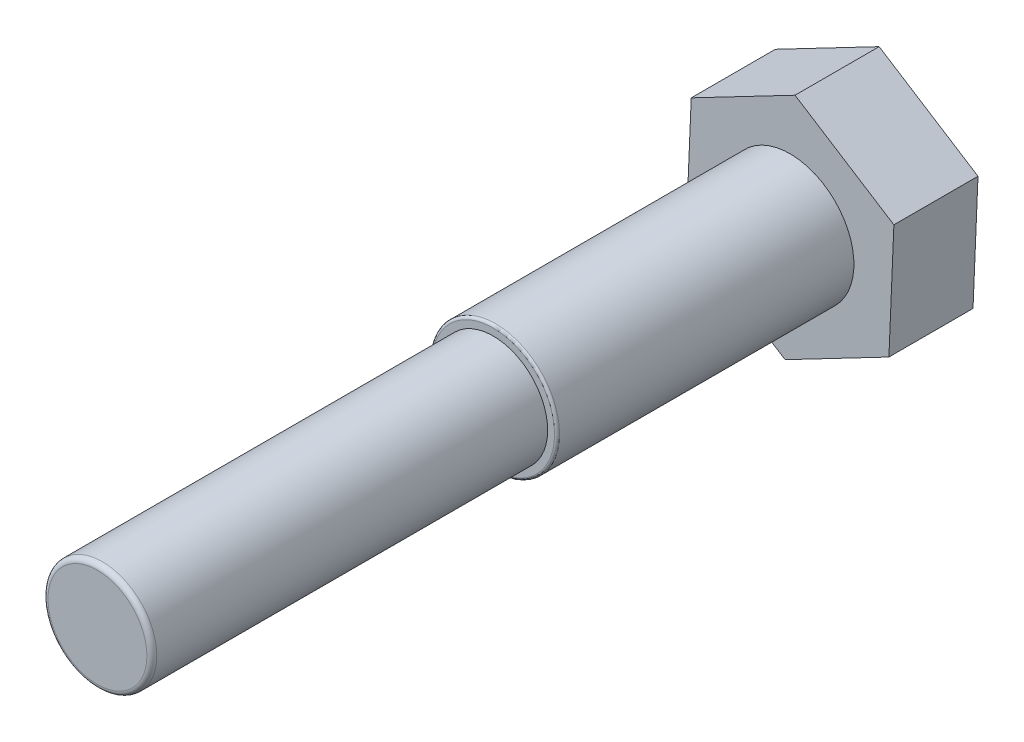
ISO-10303-21;
HEADER;
FILE_DESCRIPTION(('STEP AP214'),'2;1');
FILE_NAME('part.step','',(''),(''),'','','');
FILE_SCHEMA(('AUTOMOTIVE_DESIGN { 1 0 10303 214 1 1 1 1 }'));
ENDSEC;
DATA;
#1=APPLICATION_CONTEXT('core data for automotive mechanical design processes');
#2=APPLICATION_PROTOCOL_DEFINITION('international standard','automotive_design',2000,#1);
#3=PRODUCT_CONTEXT('',#1,'mechanical');
#4=PRODUCT('Part','Part','',(#3));
#5=PRODUCT_RELATED_PRODUCT_CATEGORY('part','',(#4));
#6=PRODUCT_DEFINITION_FORMATION('','',#4);
#7=PRODUCT_DEFINITION_CONTEXT('part definition',#1,'design');
#8=PRODUCT_DEFINITION('design','',#6,#7);
#9=PRODUCT_DEFINITION_SHAPE('','',#8);
#10=(LENGTH_UNIT() NAMED_UNIT(*) SI_UNIT(.MILLI.,.METRE.));
#11=(NAMED_UNIT(*) PLANE_ANGLE_UNIT() SI_UNIT($,.RADIAN.));
#12=(NAMED_UNIT(*) SI_UNIT($,.STERADIAN.) SOLID_ANGLE_UNIT());
#13=UNCERTAINTY_MEASURE_WITH_UNIT(LENGTH_MEASURE(1.E-05),#10,'distance_accuracy_value','');
#14=(GEOMETRIC_REPRESENTATION_CONTEXT(3) GLOBAL_UNCERTAINTY_ASSIGNED_CONTEXT((#13)) GLOBAL_UNIT_ASSIGNED_CONTEXT((#10,
#11,#12)) REPRESENTATION_CONTEXT('',''));
#15=CARTESIAN_POINT('',(0.,0.,0.));
#16=DIRECTION('',(0.,0.,1.));
#17=DIRECTION('',(1.,0.,0.));
#18=AXIS2_PLACEMENT_3D('',#15,#16,#17);
#19=CARTESIAN_POINT('',(0.,0.,77.));
#20=DIRECTION('',(0.,0.,1.));
#21=DIRECTION('',(1.,0.,0.));
#22=AXIS2_PLACEMENT_3D('',#19,#20,#21);
#23=PLANE('',#22);
#24=CARTESIAN_POINT('',(0.,0.,77.));
#25=DIRECTION('',(0.,0.,1.));
#26=DIRECTION('',(1.,0.,0.));
#27=AXIS2_PLACEMENT_3D('',#24,#25,#26);
#28=CIRCLE('',#27,12.4);
#29=CARTESIAN_POINT('',(12.4,0.,77.));
#30=VERTEX_POINT('',#29);
#31=EDGE_CURVE('E45',#30,#30,#28,.T.);
#32=ORIENTED_EDGE('',*,*,#31,.T.);
#33=EDGE_LOOP('',(#32));
#34=FACE_BOUND('',#33,.T.);
#35=CARTESIAN_POINT('',(0.,0.,77.));
#36=DIRECTION('',(0.,0.,1.));
#37=DIRECTION('',(1.,0.,0.));
#38=AXIS2_PLACEMENT_3D('',#35,#36,#37);
#39=CIRCLE('',#38,11.);
#40=CARTESIAN_POINT('',(11.,0.,77.));
#41=VERTEX_POINT('',#40);
#42=EDGE_CURVE('E127',#41,#41,#39,.T.);
#43=ORIENTED_EDGE('',*,*,#42,.F.);
#44=EDGE_LOOP('',(#43));
#45=FACE_BOUND('',#44,.T.);
#46=ADVANCED_FACE('F36',(#34,#45),#23,.T.);
#47=CARTESIAN_POINT('',(18.9733976863162,-36.3457037383633,17.));
#48=DIRECTION('',(0.,0.,-1.));
#49=DIRECTION('',(-1.,0.,0.));
#50=AXIS2_PLACEMENT_3D('',#47,#48,#49);
#51=PLANE('',#50);
#52=DIRECTION('',(0.0424733530909036,0.999097599975706,0.));
#53=VECTOR('',#52,1.);
#54=CARTESIAN_POINT('',(19.9787997617734,-12.6957037383635,17.));
#55=LINE('',#54,#53);
#56=CARTESIAN_POINT('',(19.9787997617734,-12.6957037383635,17.));
#57=VERTEX_POINT('',#56);
#58=CARTESIAN_POINT('',(20.9842018372306,10.9542962616365,17.));
#59=VERTEX_POINT('',#58);
#60=EDGE_CURVE('E134',#57,#59,#55,.T.);
#61=ORIENTED_EDGE('',*,*,#60,.T.);
#62=DIRECTION('',(-0.844007225893572,0.536331802748482,0.));
#63=VECTOR('',#62,1.);
#64=CARTESIAN_POINT('',(20.9842018372306,10.9542962616365,17.));
#65=LINE('',#64,#63);
#66=CARTESIAN_POINT('',(1.0054020754572,23.65,17.));
#67=VERTEX_POINT('',#66);
#68=EDGE_CURVE('E91',#59,#67,#65,.T.);
#69=ORIENTED_EDGE('',*,*,#68,.T.);
#70=DIRECTION('',(-0.886480578984472,-0.462765797227231,0.));
#71=VECTOR('',#70,1.);
#72=CARTESIAN_POINT('',(1.0054020754572,23.65,17.));
#73=LINE('',#72,#71);
#74=CARTESIAN_POINT('',(-19.9787997617736,12.6957037383632,17.));
#75=VERTEX_POINT('',#74);
#76=EDGE_CURVE('E105',#67,#75,#73,.T.);
#77=ORIENTED_EDGE('',*,*,#76,.T.);
#78=DIRECTION('',(-0.0424733530908878,-0.999097599975706,0.));
#79=VECTOR('',#78,1.);
#80=CARTESIAN_POINT('',(-19.9787997617736,12.6957037383632,17.));
#81=LINE('',#80,#79);
#82=CARTESIAN_POINT('',(-20.9842018372304,-10.9542962616368,17.));
#83=VERTEX_POINT('',#82);
#84=EDGE_CURVE('E98',#75,#83,#81,.T.);
#85=ORIENTED_EDGE('',*,*,#84,.T.);
#86=DIRECTION('',(0.844007225893576,-0.536331802748476,0.));
#87=VECTOR('',#86,1.);
#88=CARTESIAN_POINT('',(-20.9842018372304,-10.9542962616368,17.));
#89=LINE('',#88,#87);
#90=CARTESIAN_POINT('',(-1.00540207545719,-23.65,17.));
#91=VERTEX_POINT('',#90);
#92=EDGE_CURVE('E103',#83,#91,#89,.T.);
#93=ORIENTED_EDGE('',*,*,#92,.T.);
#94=DIRECTION('',(0.886480578984476,0.462765797227224,0.));
#95=VECTOR('',#94,1.);
#96=CARTESIAN_POINT('',(-1.00540207545719,-23.65,17.));
#97=LINE('',#96,#95);
#98=EDGE_CURVE('E53',#91,#57,#97,.T.);
#99=ORIENTED_EDGE('',*,*,#98,.T.);
#100=EDGE_LOOP('',(#61,#69,#77,#85,#93,#99));
#101=FACE_BOUND('',#100,.T.);
#102=CARTESIAN_POINT('',(0.,0.,17.));
#103=DIRECTION('',(0.,0.,-1.));
#104=DIRECTION('',(-1.,0.,0.));
#105=AXIS2_PLACEMENT_3D('',#102,#103,#104);
#106=CIRCLE('',#105,12.9);
#107=CARTESIAN_POINT('',(-12.9,0.,17.));
#108=VERTEX_POINT('',#107);
#109=EDGE_CURVE('E143',#108,#108,#106,.F.);
#110=ORIENTED_EDGE('',*,*,#109,.F.);
#111=EDGE_LOOP('',(#110));
#112=FACE_BOUND('',#111,.T.);
#113=ADVANCED_FACE('F100',(#101,#112),#51,.F.);
#114=CARTESIAN_POINT('',(19.9787997617734,-12.6957037383635,17.));
#115=DIRECTION('',(-0.999097599975706,0.0424733530909036,0.));
#116=DIRECTION('',(-0.0424733530909036,-0.999097599975706,0.));
#117=AXIS2_PLACEMENT_3D('',#114,#115,#116);
#118=PLANE('',#117);
#119=DIRECTION('',(0.0424733530909036,0.999097599975706,0.));
#120=VECTOR('',#119,1.);
#121=CARTESIAN_POINT('',(19.9787997617734,-12.6957037383635,0.));
#122=LINE('',#121,#120);
#123=CARTESIAN_POINT('',(19.9787997617734,-12.6957037383635,0.));
#124=VERTEX_POINT('',#123);
#125=CARTESIAN_POINT('',(20.9842018372306,10.9542962616365,0.));
#126=VERTEX_POINT('',#125);
#127=EDGE_CURVE('E123',#124,#126,#122,.T.);
#128=ORIENTED_EDGE('',*,*,#127,.T.);
#129=DIRECTION('',(0.,0.,-1.));
#130=VECTOR('',#129,1.);
#131=CARTESIAN_POINT('',(20.9842018372306,10.9542962616365,17.));
#132=LINE('',#131,#130);
#133=EDGE_CURVE('E141',#59,#126,#132,.T.);
#134=ORIENTED_EDGE('',*,*,#133,.F.);
#135=ORIENTED_EDGE('',*,*,#60,.F.);
#136=DIRECTION('',(0.,0.,-1.));
#137=VECTOR('',#136,1.);
#138=CARTESIAN_POINT('',(19.9787997617734,-12.6957037383635,17.));
#139=LINE('',#138,#137);
#140=EDGE_CURVE('E119',#57,#124,#139,.T.);
#141=ORIENTED_EDGE('',*,*,#140,.T.);
#142=EDGE_LOOP('',(#128,#134,#135,#141));
#143=FACE_BOUND('',#142,.T.);
#144=ADVANCED_FACE('F170',(#143),#118,.F.);
#145=CARTESIAN_POINT('',(20.9842018372306,10.9542962616365,17.));
#146=DIRECTION('',(-0.536331802748482,-0.844007225893572,0.));
#147=DIRECTION('',(0.844007225893572,-0.536331802748482,0.));
#148=AXIS2_PLACEMENT_3D('',#145,#146,#147);
#149=PLANE('',#148);
#150=DIRECTION('',(-0.844007225893572,0.536331802748482,0.));
#151=VECTOR('',#150,1.);
#152=CARTESIAN_POINT('',(20.9842018372306,10.9542962616365,0.));
#153=LINE('',#152,#151);
#154=CARTESIAN_POINT('',(1.0054020754572,23.65,0.));
#155=VERTEX_POINT('',#154);
#156=EDGE_CURVE('E126',#126,#155,#153,.T.);
#157=ORIENTED_EDGE('',*,*,#156,.T.);
#158=DIRECTION('',(0.,0.,-1.));
#159=VECTOR('',#158,1.);
#160=CARTESIAN_POINT('',(1.0054020754572,23.65,17.));
#161=LINE('',#160,#159);
#162=EDGE_CURVE('E138',#67,#155,#161,.T.);
#163=ORIENTED_EDGE('',*,*,#162,.F.);
#164=ORIENTED_EDGE('',*,*,#68,.F.);
#165=ORIENTED_EDGE('',*,*,#133,.T.);
#166=EDGE_LOOP('',(#157,#163,#164,#165));
#167=FACE_BOUND('',#166,.T.);
#168=ADVANCED_FACE('F194',(#167),#149,.F.);
#169=CARTESIAN_POINT('',(1.0054020754572,23.65,17.));
#170=DIRECTION('',(0.462765797227231,-0.886480578984472,0.));
#171=DIRECTION('',(0.886480578984472,0.462765797227231,0.));
#172=AXIS2_PLACEMENT_3D('',#169,#170,#171);
#173=PLANE('',#172);
#174=DIRECTION('',(-0.886480578984472,-0.462765797227231,0.));
#175=VECTOR('',#174,1.);
#176=CARTESIAN_POINT('',(1.0054020754572,23.65,0.));
#177=LINE('',#176,#175);
#178=CARTESIAN_POINT('',(-19.9787997617736,12.6957037383632,0.));
#179=VERTEX_POINT('',#178);
#180=EDGE_CURVE('E129',#155,#179,#177,.T.);
#181=ORIENTED_EDGE('',*,*,#180,.T.);
#182=DIRECTION('',(0.,0.,-1.));
#183=VECTOR('',#182,1.);
#184=CARTESIAN_POINT('',(-19.9787997617736,12.6957037383632,17.));
#185=LINE('',#184,#183);
#186=EDGE_CURVE('E114',#75,#179,#185,.T.);
#187=ORIENTED_EDGE('',*,*,#186,.F.);
#188=ORIENTED_EDGE('',*,*,#76,.F.);
#189=ORIENTED_EDGE('',*,*,#162,.T.);
#190=EDGE_LOOP('',(#181,#187,#188,#189));
#191=FACE_BOUND('',#190,.T.);
#192=ADVANCED_FACE('F191',(#191),#173,.F.);
#193=CARTESIAN_POINT('',(-19.9787997617736,12.6957037383632,17.));
#194=DIRECTION('',(0.999097599975706,-0.0424733530908878,0.));
#195=DIRECTION('',(0.0424733530908878,0.999097599975707,0.));
#196=AXIS2_PLACEMENT_3D('',#193,#194,#195);
#197=PLANE('',#196);
#198=DIRECTION('',(-0.0424733530908878,-0.999097599975706,0.));
#199=VECTOR('',#198,1.);
#200=CARTESIAN_POINT('',(-19.9787997617736,12.6957037383632,0.));
#201=LINE('',#200,#199);
#202=CARTESIAN_POINT('',(-20.9842018372304,-10.9542962616368,0.));
#203=VERTEX_POINT('',#202);
#204=EDGE_CURVE('E113',#179,#203,#201,.T.);
#205=ORIENTED_EDGE('',*,*,#204,.T.);
#206=DIRECTION('',(0.,0.,-1.));
#207=VECTOR('',#206,1.);
#208=CARTESIAN_POINT('',(-20.9842018372304,-10.9542962616368,17.));
#209=LINE('',#208,#207);
#210=EDGE_CURVE('E110',#83,#203,#209,.T.);
#211=ORIENTED_EDGE('',*,*,#210,.F.);
#212=ORIENTED_EDGE('',*,*,#84,.F.);
#213=ORIENTED_EDGE('',*,*,#186,.T.);
#214=EDGE_LOOP('',(#205,#211,#212,#213));
#215=FACE_BOUND('',#214,.T.);
#216=ADVANCED_FACE('F111',(#215),#197,.F.);
#217=CARTESIAN_POINT('',(-20.9842018372304,-10.9542962616368,17.));
#218=DIRECTION('',(0.536331802748476,0.844007225893576,0.));
#219=DIRECTION('',(-0.844007225893576,0.536331802748476,0.));
#220=AXIS2_PLACEMENT_3D('',#217,#218,#219);
#221=PLANE('',#220);
#222=DIRECTION('',(0.844007225893576,-0.536331802748476,0.));
#223=VECTOR('',#222,1.);
#224=CARTESIAN_POINT('',(-20.9842018372304,-10.9542962616368,0.));
#225=LINE('',#224,#223);
#226=CARTESIAN_POINT('',(-1.00540207545719,-23.65,0.));
#227=VERTEX_POINT('',#226);
#228=EDGE_CURVE('E76',#203,#227,#225,.T.);
#229=ORIENTED_EDGE('',*,*,#228,.T.);
#230=DIRECTION('',(0.,0.,-1.));
#231=VECTOR('',#230,1.);
#232=CARTESIAN_POINT('',(-1.00540207545719,-23.65,17.));
#233=LINE('',#232,#231);
#234=EDGE_CURVE('E115',#91,#227,#233,.T.);
#235=ORIENTED_EDGE('',*,*,#234,.F.);
#236=ORIENTED_EDGE('',*,*,#92,.F.);
#237=ORIENTED_EDGE('',*,*,#210,.T.);
#238=EDGE_LOOP('',(#229,#235,#236,#237));
#239=FACE_BOUND('',#238,.T.);
#240=ADVANCED_FACE('F117',(#239),#221,.F.);
#241=CARTESIAN_POINT('',(-1.00540207545719,-23.65,17.));
#242=DIRECTION('',(-0.462765797227224,0.886480578984476,0.));
#243=DIRECTION('',(-0.886480578984476,-0.462765797227224,0.));
#244=AXIS2_PLACEMENT_3D('',#241,#242,#243);
#245=PLANE('',#244);
#246=DIRECTION('',(0.886480578984476,0.462765797227224,0.));
#247=VECTOR('',#246,1.);
#248=CARTESIAN_POINT('',(-1.00540207545719,-23.65,0.));
#249=LINE('',#248,#247);
#250=EDGE_CURVE('E82',#227,#124,#249,.T.);
#251=ORIENTED_EDGE('',*,*,#250,.T.);
#252=ORIENTED_EDGE('',*,*,#140,.F.);
#253=ORIENTED_EDGE('',*,*,#98,.F.);
#254=ORIENTED_EDGE('',*,*,#234,.T.);
#255=EDGE_LOOP('',(#251,#252,#253,#254));
#256=FACE_BOUND('',#255,.T.);
#257=ADVANCED_FACE('F183',(#256),#245,.F.);
#258=CARTESIAN_POINT('',(18.9733976863162,-36.3457037383633,0.));
#259=DIRECTION('',(0.,0.,-1.));
#260=DIRECTION('',(-1.,0.,0.));
#261=AXIS2_PLACEMENT_3D('',#258,#259,#260);
#262=PLANE('',#261);
#263=ORIENTED_EDGE('',*,*,#127,.F.);
#264=ORIENTED_EDGE('',*,*,#250,.F.);
#265=ORIENTED_EDGE('',*,*,#228,.F.);
#266=ORIENTED_EDGE('',*,*,#204,.F.);
#267=ORIENTED_EDGE('',*,*,#180,.F.);
#268=ORIENTED_EDGE('',*,*,#156,.F.);
#269=EDGE_LOOP('',(#263,#264,#265,#266,#267,#268));
#270=FACE_BOUND('',#269,.T.);
#271=ADVANCED_FACE('F178',(#270),#262,.T.);
#272=CARTESIAN_POINT('',(0.,0.,77.));
#273=DIRECTION('',(0.,0.,-1.));
#274=DIRECTION('',(-1.,0.,0.));
#275=AXIS2_PLACEMENT_3D('',#272,#273,#274);
#276=CYLINDRICAL_SURFACE('',#275,12.9);
#277=CARTESIAN_POINT('',(0.,0.,76.5));
#278=DIRECTION('',(0.,0.,1.));
#279=DIRECTION('',(1.,0.,0.));
#280=AXIS2_PLACEMENT_3D('',#277,#278,#279);
#281=CIRCLE('',#280,12.9);
#282=CARTESIAN_POINT('',(12.9,0.,76.5));
#283=VERTEX_POINT('',#282);
#284=EDGE_CURVE('E11',#283,#283,#281,.F.);
#285=ORIENTED_EDGE('',*,*,#284,.T.);
#286=EDGE_LOOP('',(#285));
#287=FACE_BOUND('',#286,.T.);
#288=ORIENTED_EDGE('',*,*,#109,.T.);
#289=EDGE_LOOP('',(#288));
#290=FACE_BOUND('',#289,.T.);
#291=ADVANCED_FACE('F176',(#287,#290),#276,.T.);
#292=CARTESIAN_POINT('',(0.,0.,157.));
#293=DIRECTION('',(0.,0.,-1.));
#294=DIRECTION('',(-1.,0.,0.));
#295=AXIS2_PLACEMENT_3D('',#292,#293,#294);
#296=CYLINDRICAL_SURFACE('',#295,11.);
#297=CARTESIAN_POINT('',(0.,0.,156.));
#298=DIRECTION('',(0.,0.,1.));
#299=DIRECTION('',(1.,0.,0.));
#300=AXIS2_PLACEMENT_3D('',#297,#298,#299);
#301=CIRCLE('',#300,11.);
#302=CARTESIAN_POINT('',(11.,0.,156.));
#303=VERTEX_POINT('',#302);
#304=EDGE_CURVE('E149',#303,#303,#301,.F.);
#305=ORIENTED_EDGE('',*,*,#304,.T.);
#306=EDGE_LOOP('',(#305));
#307=FACE_BOUND('',#306,.T.);
#308=ORIENTED_EDGE('',*,*,#42,.T.);
#309=EDGE_LOOP('',(#308));
#310=FACE_BOUND('',#309,.T.);
#311=ADVANCED_FACE('F174',(#307,#310),#296,.T.);
#312=CARTESIAN_POINT('',(0.,0.,157.));
#313=DIRECTION('',(0.,0.,1.));
#314=DIRECTION('',(1.,0.,0.));
#315=AXIS2_PLACEMENT_3D('',#312,#313,#314);
#316=PLANE('',#315);
#317=CARTESIAN_POINT('',(0.,0.,157.));
#318=DIRECTION('',(0.,0.,1.));
#319=DIRECTION('',(1.,0.,0.));
#320=AXIS2_PLACEMENT_3D('',#317,#318,#319);
#321=CIRCLE('',#320,10.);
#322=CARTESIAN_POINT('',(10.,0.,157.));
#323=VERTEX_POINT('',#322);
#324=EDGE_CURVE('E146',#323,#323,#321,.T.);
#325=ORIENTED_EDGE('',*,*,#324,.T.);
#326=EDGE_LOOP('',(#325));
#327=FACE_BOUND('',#326,.T.);
#328=ADVANCED_FACE('F162',(#327),#316,.T.);
#329=CARTESIAN_POINT('',(0.,0.,156.));
#330=DIRECTION('',(0.,0.,1.));
#331=DIRECTION('',(1.,0.,0.));
#332=AXIS2_PLACEMENT_3D('',#329,#330,#331);
#333=TOROIDAL_SURFACE('',#332,10.,1.);
#334=ORIENTED_EDGE('',*,*,#304,.F.);
#335=EDGE_LOOP('',(#334));
#336=FACE_BOUND('',#335,.T.);
#337=ORIENTED_EDGE('',*,*,#324,.F.);
#338=EDGE_LOOP('',(#337));
#339=FACE_BOUND('',#338,.T.);
#340=ADVANCED_FACE('F157',(#336,#339),#333,.T.);
#341=CARTESIAN_POINT('',(0.,0.,76.5));
#342=DIRECTION('',(0.,0.,1.));
#343=DIRECTION('',(1.,0.,0.));
#344=AXIS2_PLACEMENT_3D('',#341,#342,#343);
#345=TOROIDAL_SURFACE('',#344,12.4,0.5);
#346=ORIENTED_EDGE('',*,*,#284,.F.);
#347=EDGE_LOOP('',(#346));
#348=FACE_BOUND('',#347,.T.);
#349=ORIENTED_EDGE('',*,*,#31,.F.);
#350=EDGE_LOOP('',(#349));
#351=FACE_BOUND('',#350,.T.);
#352=ADVANCED_FACE('F38',(#348,#351),#345,.T.);
#353=CLOSED_SHELL('',(#46,#113,#144,#168,#192,#216,#240,#257,#271,#291,#311,#328,#340,#352));
#354=MANIFOLD_SOLID_BREP('B2',#353);
#355=ADVANCED_BREP_SHAPE_REPRESENTATION('',(#18,#354),#14);
#356=SHAPE_DEFINITION_REPRESENTATION(#9,#355);
ENDSEC;
END-ISO-10303-21;
